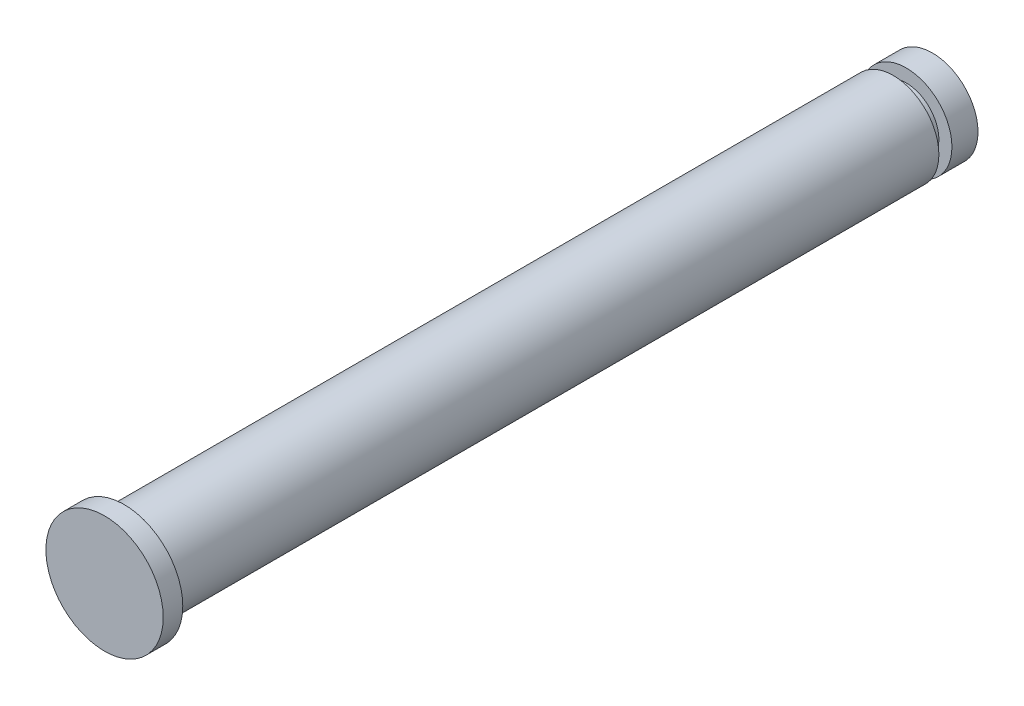
ISO-10303-21;
HEADER;
FILE_DESCRIPTION(('STEP AP214'),'2;1');
FILE_NAME('part.step','',(''),(''),'','','');
FILE_SCHEMA(('AUTOMOTIVE_DESIGN { 1 0 10303 214 1 1 1 1 }'));
ENDSEC;
DATA;
#1=APPLICATION_CONTEXT('core data for automotive mechanical design processes');
#2=APPLICATION_PROTOCOL_DEFINITION('international standard','automotive_design',2000,#1);
#3=PRODUCT_CONTEXT('',#1,'mechanical');
#4=PRODUCT('Part','Part','',(#3));
#5=PRODUCT_RELATED_PRODUCT_CATEGORY('part','',(#4));
#6=PRODUCT_DEFINITION_FORMATION('','',#4);
#7=PRODUCT_DEFINITION_CONTEXT('part definition',#1,'design');
#8=PRODUCT_DEFINITION('design','',#6,#7);
#9=PRODUCT_DEFINITION_SHAPE('','',#8);
#10=(LENGTH_UNIT() NAMED_UNIT(*) SI_UNIT(.MILLI.,.METRE.));
#11=(NAMED_UNIT(*) PLANE_ANGLE_UNIT() SI_UNIT($,.RADIAN.));
#12=(NAMED_UNIT(*) SI_UNIT($,.STERADIAN.) SOLID_ANGLE_UNIT());
#13=UNCERTAINTY_MEASURE_WITH_UNIT(LENGTH_MEASURE(1.E-05),#10,'distance_accuracy_value','');
#14=(GEOMETRIC_REPRESENTATION_CONTEXT(3) GLOBAL_UNCERTAINTY_ASSIGNED_CONTEXT((#13)) GLOBAL_UNIT_ASSIGNED_CONTEXT((#10,
#11,#12)) REPRESENTATION_CONTEXT('',''));
#15=CARTESIAN_POINT('',(0.,0.,0.));
#16=DIRECTION('',(0.,0.,1.));
#17=DIRECTION('',(1.,0.,0.));
#18=AXIS2_PLACEMENT_3D('',#15,#16,#17);
#19=CARTESIAN_POINT('',(0.,0.,0.));
#20=DIRECTION('',(0.,0.,1.));
#21=DIRECTION('',(-1.,0.,0.));
#22=AXIS2_PLACEMENT_3D('',#19,#20,#21);
#23=PLANE('',#22);
#24=CARTESIAN_POINT('',(0.,0.,0.));
#25=DIRECTION('',(0.,0.,1.));
#26=DIRECTION('',(1.,0.,0.));
#27=AXIS2_PLACEMENT_3D('',#24,#25,#26);
#28=CIRCLE('',#27,3.5);
#29=CARTESIAN_POINT('',(3.5,0.,0.));
#30=VERTEX_POINT('',#29);
#31=EDGE_CURVE('E10',#30,#30,#28,.T.);
#32=ORIENTED_EDGE('',*,*,#31,.F.);
#33=EDGE_LOOP('',(#32));
#34=FACE_BOUND('',#33,.T.);
#35=ADVANCED_FACE('F39',(#34),#23,.F.);
#36=CARTESIAN_POINT('',(0.,0.,0.));
#37=DIRECTION('',(0.,0.,-1.));
#38=DIRECTION('',(1.,0.,0.));
#39=AXIS2_PLACEMENT_3D('',#36,#37,#38);
#40=CYLINDRICAL_SURFACE('',#39,3.5);
#41=ORIENTED_EDGE('',*,*,#31,.T.);
#42=EDGE_LOOP('',(#41));
#43=FACE_BOUND('',#42,.T.);
#44=CARTESIAN_POINT('',(0.,0.,2.));
#45=DIRECTION('',(0.,0.,1.));
#46=DIRECTION('',(1.,0.,0.));
#47=AXIS2_PLACEMENT_3D('',#44,#45,#46);
#48=CIRCLE('',#47,3.5);
#49=CARTESIAN_POINT('',(3.5,0.,2.));
#50=VERTEX_POINT('',#49);
#51=EDGE_CURVE('E46',#50,#50,#48,.T.);
#52=ORIENTED_EDGE('',*,*,#51,.F.);
#53=EDGE_LOOP('',(#52));
#54=FACE_BOUND('',#53,.T.);
#55=ADVANCED_FACE('F92',(#43,#54),#40,.T.);
#56=CARTESIAN_POINT('',(0.,3.5,2.));
#57=DIRECTION('',(0.,0.,-1.));
#58=DIRECTION('',(1.,0.,0.));
#59=AXIS2_PLACEMENT_3D('',#56,#57,#58);
#60=PLANE('',#59);
#61=ORIENTED_EDGE('',*,*,#51,.T.);
#62=EDGE_LOOP('',(#61));
#63=FACE_BOUND('',#62,.T.);
#64=CARTESIAN_POINT('',(0.,0.,2.));
#65=DIRECTION('',(0.,0.,1.));
#66=DIRECTION('',(1.,0.,0.));
#67=AXIS2_PLACEMENT_3D('',#64,#65,#66);
#68=CIRCLE('',#67,2.5);
#69=CARTESIAN_POINT('',(2.5,0.,2.));
#70=VERTEX_POINT('',#69);
#71=EDGE_CURVE('E51',#70,#70,#68,.T.);
#72=ORIENTED_EDGE('',*,*,#71,.F.);
#73=EDGE_LOOP('',(#72));
#74=FACE_BOUND('',#73,.T.);
#75=ADVANCED_FACE('F97',(#63,#74),#60,.F.);
#76=CARTESIAN_POINT('',(0.,0.,0.));
#77=DIRECTION('',(0.,0.,-1.));
#78=DIRECTION('',(1.,0.,0.));
#79=AXIS2_PLACEMENT_3D('',#76,#77,#78);
#80=CYLINDRICAL_SURFACE('',#79,2.5);
#81=ORIENTED_EDGE('',*,*,#71,.T.);
#82=EDGE_LOOP('',(#81));
#83=FACE_BOUND('',#82,.T.);
#84=CARTESIAN_POINT('',(0.,0.,3.));
#85=DIRECTION('',(0.,0.,1.));
#86=DIRECTION('',(1.,0.,0.));
#87=AXIS2_PLACEMENT_3D('',#84,#85,#86);
#88=CIRCLE('',#87,2.5);
#89=CARTESIAN_POINT('',(2.5,0.,3.));
#90=VERTEX_POINT('',#89);
#91=EDGE_CURVE('E57',#90,#90,#88,.T.);
#92=ORIENTED_EDGE('',*,*,#91,.F.);
#93=EDGE_LOOP('',(#92));
#94=FACE_BOUND('',#93,.T.);
#95=ADVANCED_FACE('F101',(#83,#94),#80,.T.);
#96=CARTESIAN_POINT('',(0.,3.5,3.));
#97=DIRECTION('',(0.,0.,1.));
#98=DIRECTION('',(-1.,0.,0.));
#99=AXIS2_PLACEMENT_3D('',#96,#97,#98);
#100=PLANE('',#99);
#101=ORIENTED_EDGE('',*,*,#91,.T.);
#102=EDGE_LOOP('',(#101));
#103=FACE_BOUND('',#102,.T.);
#104=CARTESIAN_POINT('',(0.,0.,3.));
#105=DIRECTION('',(0.,0.,1.));
#106=DIRECTION('',(1.,0.,0.));
#107=AXIS2_PLACEMENT_3D('',#104,#105,#106);
#108=CIRCLE('',#107,3.5);
#109=CARTESIAN_POINT('',(3.5,0.,3.));
#110=VERTEX_POINT('',#109);
#111=EDGE_CURVE('E63',#110,#110,#108,.T.);
#112=ORIENTED_EDGE('',*,*,#111,.F.);
#113=EDGE_LOOP('',(#112));
#114=FACE_BOUND('',#113,.T.);
#115=ADVANCED_FACE('F107',(#103,#114),#100,.F.);
#116=CARTESIAN_POINT('',(0.,0.,0.));
#117=DIRECTION('',(0.,0.,-1.));
#118=DIRECTION('',(1.,0.,0.));
#119=AXIS2_PLACEMENT_3D('',#116,#117,#118);
#120=CYLINDRICAL_SURFACE('',#119,3.5);
#121=ORIENTED_EDGE('',*,*,#111,.T.);
#122=EDGE_LOOP('',(#121));
#123=FACE_BOUND('',#122,.T.);
#124=CARTESIAN_POINT('',(0.,0.,62.));
#125=DIRECTION('',(0.,0.,1.));
#126=DIRECTION('',(1.,0.,0.));
#127=AXIS2_PLACEMENT_3D('',#124,#125,#126);
#128=CIRCLE('',#127,3.5);
#129=CARTESIAN_POINT('',(3.5,0.,62.));
#130=VERTEX_POINT('',#129);
#131=EDGE_CURVE('E66',#130,#130,#128,.T.);
#132=ORIENTED_EDGE('',*,*,#131,.F.);
#133=EDGE_LOOP('',(#132));
#134=FACE_BOUND('',#133,.T.);
#135=ADVANCED_FACE('F88',(#123,#134),#120,.T.);
#136=CARTESIAN_POINT('',(0.,3.5,62.));
#137=DIRECTION('',(0.,0.,1.));
#138=DIRECTION('',(-1.,0.,0.));
#139=AXIS2_PLACEMENT_3D('',#136,#137,#138);
#140=PLANE('',#139);
#141=ORIENTED_EDGE('',*,*,#131,.T.);
#142=EDGE_LOOP('',(#141));
#143=FACE_BOUND('',#142,.T.);
#144=CARTESIAN_POINT('',(0.,0.,62.));
#145=DIRECTION('',(0.,0.,1.));
#146=DIRECTION('',(1.,0.,0.));
#147=AXIS2_PLACEMENT_3D('',#144,#145,#146);
#148=CIRCLE('',#147,4.5);
#149=CARTESIAN_POINT('',(4.5,0.,62.));
#150=VERTEX_POINT('',#149);
#151=EDGE_CURVE('E69',#150,#150,#148,.T.);
#152=ORIENTED_EDGE('',*,*,#151,.F.);
#153=EDGE_LOOP('',(#152));
#154=FACE_BOUND('',#153,.T.);
#155=ADVANCED_FACE('F80',(#143,#154),#140,.F.);
#156=CARTESIAN_POINT('',(0.,0.,0.));
#157=DIRECTION('',(0.,0.,-1.));
#158=DIRECTION('',(1.,0.,0.));
#159=AXIS2_PLACEMENT_3D('',#156,#157,#158);
#160=CYLINDRICAL_SURFACE('',#159,4.5);
#161=ORIENTED_EDGE('',*,*,#151,.T.);
#162=EDGE_LOOP('',(#161));
#163=FACE_BOUND('',#162,.T.);
#164=CARTESIAN_POINT('',(0.,0.,63.5));
#165=DIRECTION('',(0.,0.,1.));
#166=DIRECTION('',(1.,0.,0.));
#167=AXIS2_PLACEMENT_3D('',#164,#165,#166);
#168=CIRCLE('',#167,4.5);
#169=CARTESIAN_POINT('',(4.5,0.,63.5));
#170=VERTEX_POINT('',#169);
#171=EDGE_CURVE('E72',#170,#170,#168,.T.);
#172=ORIENTED_EDGE('',*,*,#171,.F.);
#173=EDGE_LOOP('',(#172));
#174=FACE_BOUND('',#173,.T.);
#175=ADVANCED_FACE('F78',(#163,#174),#160,.T.);
#176=CARTESIAN_POINT('',(0.,4.5,63.5));
#177=DIRECTION('',(0.,0.,-1.));
#178=DIRECTION('',(1.,0.,0.));
#179=AXIS2_PLACEMENT_3D('',#176,#177,#178);
#180=PLANE('',#179);
#181=ORIENTED_EDGE('',*,*,#171,.T.);
#182=EDGE_LOOP('',(#181));
#183=FACE_BOUND('',#182,.T.);
#184=ADVANCED_FACE('F76',(#183),#180,.F.);
#185=CLOSED_SHELL('',(#35,#55,#75,#95,#115,#135,#155,#175,#184));
#186=MANIFOLD_SOLID_BREP('B2',#185);
#187=ADVANCED_BREP_SHAPE_REPRESENTATION('',(#18,#186),#14);
#188=SHAPE_DEFINITION_REPRESENTATION(#9,#187);
ENDSEC;
END-ISO-10303-21;
